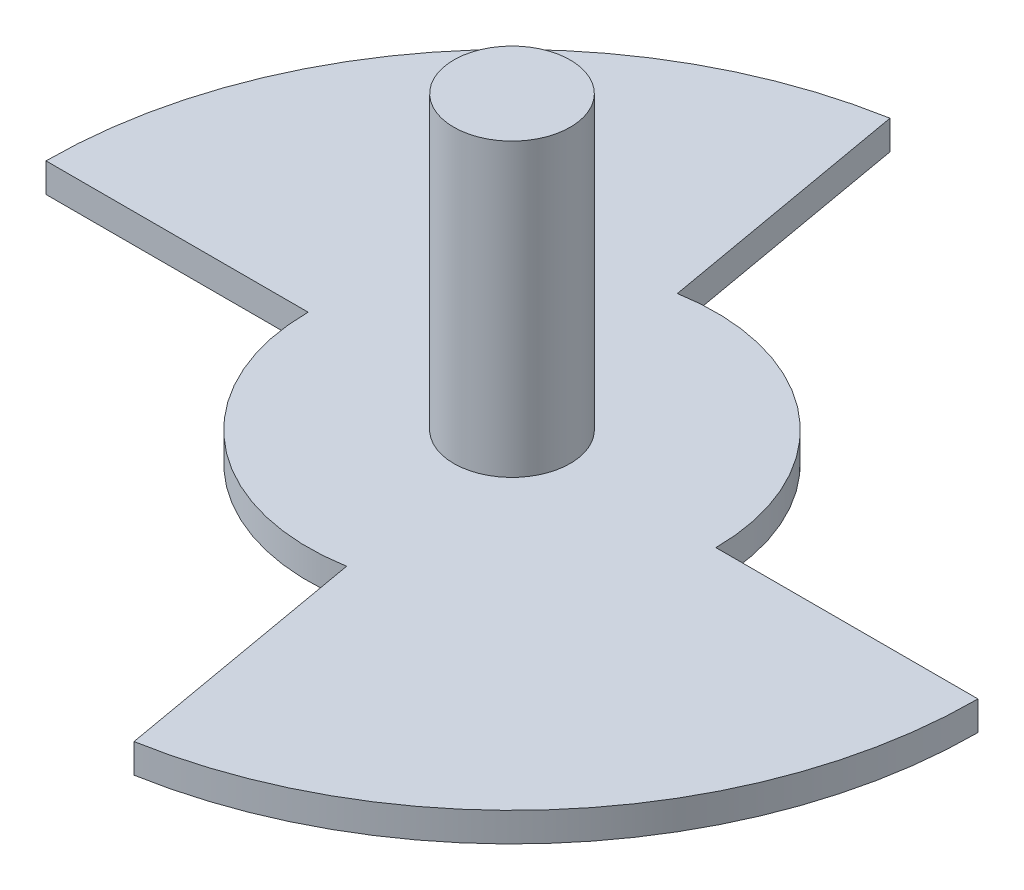
ISO-10303-21;
HEADER;
FILE_DESCRIPTION(('STEP AP214'),'2;1');
FILE_NAME('part.step','',(''),(''),'','','');
FILE_SCHEMA(('AUTOMOTIVE_DESIGN { 1 0 10303 214 1 1 1 1 }'));
ENDSEC;
DATA;
#1=APPLICATION_CONTEXT('core data for automotive mechanical design processes');
#2=APPLICATION_PROTOCOL_DEFINITION('international standard','automotive_design',2000,#1);
#3=PRODUCT_CONTEXT('',#1,'mechanical');
#4=PRODUCT('Part','Part','',(#3));
#5=PRODUCT_RELATED_PRODUCT_CATEGORY('part','',(#4));
#6=PRODUCT_DEFINITION_FORMATION('','',#4);
#7=PRODUCT_DEFINITION_CONTEXT('part definition',#1,'design');
#8=PRODUCT_DEFINITION('design','',#6,#7);
#9=PRODUCT_DEFINITION_SHAPE('','',#8);
#10=(LENGTH_UNIT() NAMED_UNIT(*) SI_UNIT(.MILLI.,.METRE.));
#11=(NAMED_UNIT(*) PLANE_ANGLE_UNIT() SI_UNIT($,.RADIAN.));
#12=(NAMED_UNIT(*) SI_UNIT($,.STERADIAN.) SOLID_ANGLE_UNIT());
#13=UNCERTAINTY_MEASURE_WITH_UNIT(LENGTH_MEASURE(1.E-05),#10,'distance_accuracy_value','');
#14=(GEOMETRIC_REPRESENTATION_CONTEXT(3) GLOBAL_UNCERTAINTY_ASSIGNED_CONTEXT((#13)) GLOBAL_UNIT_ASSIGNED_CONTEXT((#10,
#11,#12)) REPRESENTATION_CONTEXT('',''));
#15=CARTESIAN_POINT('',(0.,0.,0.));
#16=DIRECTION('',(0.,0.,1.));
#17=DIRECTION('',(1.,0.,0.));
#18=AXIS2_PLACEMENT_3D('',#15,#16,#17);
#19=CARTESIAN_POINT('',(0.,-0.25,0.));
#20=DIRECTION('',(0.,1.,0.));
#21=DIRECTION('',(0.,0.,1.));
#22=AXIS2_PLACEMENT_3D('',#19,#20,#21);
#23=CYLINDRICAL_SURFACE('',#22,3.5);
#24=DIRECTION('',(0.,1.,0.));
#25=VECTOR('',#24,1.);
#26=CARTESIAN_POINT('',(0.607768621834248,-0.25,3.44682713554273));
#27=LINE('',#26,#25);
#28=CARTESIAN_POINT('',(0.607768621834248,-0.25,3.44682713554273));
#29=VERTEX_POINT('',#28);
#30=CARTESIAN_POINT('',(0.607768621834248,0.25,3.44682713554273));
#31=VERTEX_POINT('',#30);
#32=EDGE_CURVE('E36',#29,#31,#27,.T.);
#33=ORIENTED_EDGE('',*,*,#32,.T.);
#34=CARTESIAN_POINT('',(0.,0.25,0.));
#35=DIRECTION('',(0.,1.,0.));
#36=DIRECTION('',(0.,0.,1.));
#37=AXIS2_PLACEMENT_3D('',#34,#35,#36);
#38=CIRCLE('',#37,3.5);
#39=CARTESIAN_POINT('',(-3.5,0.25,0.));
#40=VERTEX_POINT('',#39);
#41=EDGE_CURVE('E97',#40,#31,#38,.T.);
#42=ORIENTED_EDGE('',*,*,#41,.F.);
#43=DIRECTION('',(0.,1.,0.));
#44=VECTOR('',#43,1.);
#45=CARTESIAN_POINT('',(-3.5,-0.25,0.));
#46=LINE('',#45,#44);
#47=CARTESIAN_POINT('',(-3.5,-0.25,0.));
#48=VERTEX_POINT('',#47);
#49=EDGE_CURVE('E11',#48,#40,#46,.T.);
#50=ORIENTED_EDGE('',*,*,#49,.F.);
#51=CARTESIAN_POINT('',(0.,-0.25,0.));
#52=DIRECTION('',(0.,1.,0.));
#53=DIRECTION('',(0.,0.,1.));
#54=AXIS2_PLACEMENT_3D('',#51,#52,#53);
#55=CIRCLE('',#54,3.5);
#56=EDGE_CURVE('E98',#48,#29,#55,.T.);
#57=ORIENTED_EDGE('',*,*,#56,.T.);
#58=EDGE_LOOP('',(#33,#42,#50,#57));
#59=FACE_BOUND('',#58,.T.);
#60=ADVANCED_FACE('F33',(#59),#23,.T.);
#61=CARTESIAN_POINT('',(-3.5,-0.25,0.));
#62=DIRECTION('',(0.,0.,1.));
#63=DIRECTION('',(1.,0.,0.));
#64=AXIS2_PLACEMENT_3D('',#61,#62,#63);
#65=PLANE('',#64);
#66=ORIENTED_EDGE('',*,*,#49,.T.);
#67=DIRECTION('',(1.,0.,0.));
#68=VECTOR('',#67,1.);
#69=CARTESIAN_POINT('',(-3.5,0.25,0.));
#70=LINE('',#69,#68);
#71=CARTESIAN_POINT('',(-8.,0.25,0.));
#72=VERTEX_POINT('',#71);
#73=EDGE_CURVE('E115',#72,#40,#70,.T.);
#74=ORIENTED_EDGE('',*,*,#73,.F.);
#75=DIRECTION('',(0.,1.,0.));
#76=VECTOR('',#75,1.);
#77=CARTESIAN_POINT('',(-8.,-0.25,0.));
#78=LINE('',#77,#76);
#79=CARTESIAN_POINT('',(-8.,-0.25,0.));
#80=VERTEX_POINT('',#79);
#81=EDGE_CURVE('E41',#80,#72,#78,.T.);
#82=ORIENTED_EDGE('',*,*,#81,.F.);
#83=DIRECTION('',(1.,0.,0.));
#84=VECTOR('',#83,1.);
#85=CARTESIAN_POINT('',(-3.5,-0.25,0.));
#86=LINE('',#85,#84);
#87=EDGE_CURVE('E103',#80,#48,#86,.T.);
#88=ORIENTED_EDGE('',*,*,#87,.T.);
#89=EDGE_LOOP('',(#66,#74,#82,#88));
#90=FACE_BOUND('',#89,.T.);
#91=ADVANCED_FACE('F184',(#90),#65,.T.);
#92=CARTESIAN_POINT('',(0.,-0.25,0.));
#93=DIRECTION('',(0.,1.,0.));
#94=DIRECTION('',(0.,0.,1.));
#95=AXIS2_PLACEMENT_3D('',#92,#93,#94);
#96=CYLINDRICAL_SURFACE('',#95,8.);
#97=ORIENTED_EDGE('',*,*,#81,.T.);
#98=CARTESIAN_POINT('',(0.,0.25,0.));
#99=DIRECTION('',(0.,1.,0.));
#100=DIRECTION('',(0.,0.,1.));
#101=AXIS2_PLACEMENT_3D('',#98,#99,#100);
#102=CIRCLE('',#101,8.);
#103=CARTESIAN_POINT('',(-1.38918542133542,0.25,-7.87846202409767));
#104=VERTEX_POINT('',#103);
#105=EDGE_CURVE('E133',#104,#72,#102,.T.);
#106=ORIENTED_EDGE('',*,*,#105,.F.);
#107=DIRECTION('',(0.,1.,0.));
#108=VECTOR('',#107,1.);
#109=CARTESIAN_POINT('',(-1.38918542133542,-0.25,-7.87846202409767));
#110=LINE('',#109,#108);
#111=CARTESIAN_POINT('',(-1.38918542133542,-0.25,-7.87846202409767));
#112=VERTEX_POINT('',#111);
#113=EDGE_CURVE('E155',#112,#104,#110,.T.);
#114=ORIENTED_EDGE('',*,*,#113,.F.);
#115=CARTESIAN_POINT('',(0.,-0.25,0.));
#116=DIRECTION('',(0.,1.,0.));
#117=DIRECTION('',(0.,0.,1.));
#118=AXIS2_PLACEMENT_3D('',#115,#116,#117);
#119=CIRCLE('',#118,8.);
#120=EDGE_CURVE('E151',#112,#80,#119,.T.);
#121=ORIENTED_EDGE('',*,*,#120,.T.);
#122=EDGE_LOOP('',(#97,#106,#114,#121));
#123=FACE_BOUND('',#122,.T.);
#124=ADVANCED_FACE('F183',(#123),#96,.T.);
#125=CARTESIAN_POINT('',(-0.607768621834246,-0.25,-3.44682713554273));
#126=DIRECTION('',(0.984807753012209,0.,-0.173648177666927));
#127=DIRECTION('',(-0.173648177666927,0.,-0.984807753012209));
#128=AXIS2_PLACEMENT_3D('',#125,#126,#127);
#129=PLANE('',#128);
#130=ORIENTED_EDGE('',*,*,#113,.T.);
#131=DIRECTION('',(-0.173648177666927,0.,-0.984807753012209));
#132=VECTOR('',#131,1.);
#133=CARTESIAN_POINT('',(-0.607768621834246,0.25,-3.44682713554273));
#134=LINE('',#133,#132);
#135=CARTESIAN_POINT('',(-0.607768621834244,0.25,-3.44682713554273));
#136=VERTEX_POINT('',#135);
#137=EDGE_CURVE('E130',#136,#104,#134,.T.);
#138=ORIENTED_EDGE('',*,*,#137,.F.);
#139=DIRECTION('',(0.,1.,0.));
#140=VECTOR('',#139,1.);
#141=CARTESIAN_POINT('',(-0.607768621834244,-0.25,-3.44682713554273));
#142=LINE('',#141,#140);
#143=CARTESIAN_POINT('',(-0.607768621834244,-0.25,-3.44682713554273));
#144=VERTEX_POINT('',#143);
#145=EDGE_CURVE('E157',#144,#136,#142,.T.);
#146=ORIENTED_EDGE('',*,*,#145,.F.);
#147=DIRECTION('',(-0.173648177666927,0.,-0.984807753012209));
#148=VECTOR('',#147,1.);
#149=CARTESIAN_POINT('',(-0.607768621834246,-0.25,-3.44682713554273));
#150=LINE('',#149,#148);
#151=EDGE_CURVE('E148',#144,#112,#150,.T.);
#152=ORIENTED_EDGE('',*,*,#151,.T.);
#153=EDGE_LOOP('',(#130,#138,#146,#152));
#154=FACE_BOUND('',#153,.T.);
#155=ADVANCED_FACE('F179',(#154),#129,.T.);
#156=CARTESIAN_POINT('',(0.,-0.25,0.));
#157=DIRECTION('',(0.,1.,0.));
#158=DIRECTION('',(0.,0.,1.));
#159=AXIS2_PLACEMENT_3D('',#156,#157,#158);
#160=CYLINDRICAL_SURFACE('',#159,3.5);
#161=ORIENTED_EDGE('',*,*,#145,.T.);
#162=CARTESIAN_POINT('',(0.,0.25,0.));
#163=DIRECTION('',(0.,1.,0.));
#164=DIRECTION('',(0.,0.,1.));
#165=AXIS2_PLACEMENT_3D('',#162,#163,#164);
#166=CIRCLE('',#165,3.5);
#167=CARTESIAN_POINT('',(3.5,0.25,0.));
#168=VERTEX_POINT('',#167);
#169=EDGE_CURVE('E127',#168,#136,#166,.T.);
#170=ORIENTED_EDGE('',*,*,#169,.F.);
#171=DIRECTION('',(0.,1.,0.));
#172=VECTOR('',#171,1.);
#173=CARTESIAN_POINT('',(3.5,-0.25,0.));
#174=LINE('',#173,#172);
#175=CARTESIAN_POINT('',(3.5,-0.25,0.));
#176=VERTEX_POINT('',#175);
#177=EDGE_CURVE('E159',#176,#168,#174,.T.);
#178=ORIENTED_EDGE('',*,*,#177,.F.);
#179=CARTESIAN_POINT('',(0.,-0.25,0.));
#180=DIRECTION('',(0.,1.,0.));
#181=DIRECTION('',(0.,0.,1.));
#182=AXIS2_PLACEMENT_3D('',#179,#180,#181);
#183=CIRCLE('',#182,3.5);
#184=EDGE_CURVE('E145',#176,#144,#183,.T.);
#185=ORIENTED_EDGE('',*,*,#184,.T.);
#186=EDGE_LOOP('',(#161,#170,#178,#185));
#187=FACE_BOUND('',#186,.T.);
#188=ADVANCED_FACE('F172',(#187),#160,.T.);
#189=CARTESIAN_POINT('',(8.,-0.25,0.));
#190=DIRECTION('',(0.,0.,-1.));
#191=DIRECTION('',(-1.,0.,0.));
#192=AXIS2_PLACEMENT_3D('',#189,#190,#191);
#193=PLANE('',#192);
#194=ORIENTED_EDGE('',*,*,#177,.T.);
#195=DIRECTION('',(-1.,0.,0.));
#196=VECTOR('',#195,1.);
#197=CARTESIAN_POINT('',(8.,0.25,0.));
#198=LINE('',#197,#196);
#199=CARTESIAN_POINT('',(8.,0.25,0.));
#200=VERTEX_POINT('',#199);
#201=EDGE_CURVE('E124',#200,#168,#198,.T.);
#202=ORIENTED_EDGE('',*,*,#201,.F.);
#203=DIRECTION('',(0.,1.,0.));
#204=VECTOR('',#203,1.);
#205=CARTESIAN_POINT('',(8.,-0.25,0.));
#206=LINE('',#205,#204);
#207=CARTESIAN_POINT('',(8.,-0.25,0.));
#208=VERTEX_POINT('',#207);
#209=EDGE_CURVE('E161',#208,#200,#206,.T.);
#210=ORIENTED_EDGE('',*,*,#209,.F.);
#211=DIRECTION('',(-1.,0.,0.));
#212=VECTOR('',#211,1.);
#213=CARTESIAN_POINT('',(8.,-0.25,0.));
#214=LINE('',#213,#212);
#215=EDGE_CURVE('E142',#208,#176,#214,.T.);
#216=ORIENTED_EDGE('',*,*,#215,.T.);
#217=EDGE_LOOP('',(#194,#202,#210,#216));
#218=FACE_BOUND('',#217,.T.);
#219=ADVANCED_FACE('F169',(#218),#193,.T.);
#220=CARTESIAN_POINT('',(0.,-0.25,0.));
#221=DIRECTION('',(0.,1.,0.));
#222=DIRECTION('',(0.,0.,1.));
#223=AXIS2_PLACEMENT_3D('',#220,#221,#222);
#224=CYLINDRICAL_SURFACE('',#223,8.);
#225=ORIENTED_EDGE('',*,*,#209,.T.);
#226=CARTESIAN_POINT('',(0.,0.25,0.));
#227=DIRECTION('',(0.,1.,0.));
#228=DIRECTION('',(0.,0.,1.));
#229=AXIS2_PLACEMENT_3D('',#226,#227,#228);
#230=CIRCLE('',#229,8.);
#231=CARTESIAN_POINT('',(1.38918542133542,0.25,7.87846202409767));
#232=VERTEX_POINT('',#231);
#233=EDGE_CURVE('E110',#232,#200,#230,.T.);
#234=ORIENTED_EDGE('',*,*,#233,.F.);
#235=DIRECTION('',(0.,1.,0.));
#236=VECTOR('',#235,1.);
#237=CARTESIAN_POINT('',(1.38918542133542,-0.25,7.87846202409767));
#238=LINE('',#237,#236);
#239=CARTESIAN_POINT('',(1.38918542133542,-0.25,7.87846202409767));
#240=VERTEX_POINT('',#239);
#241=EDGE_CURVE('E102',#240,#232,#238,.T.);
#242=ORIENTED_EDGE('',*,*,#241,.F.);
#243=CARTESIAN_POINT('',(0.,-0.25,0.));
#244=DIRECTION('',(0.,1.,0.));
#245=DIRECTION('',(0.,0.,1.));
#246=AXIS2_PLACEMENT_3D('',#243,#244,#245);
#247=CIRCLE('',#246,8.);
#248=EDGE_CURVE('E139',#240,#208,#247,.T.);
#249=ORIENTED_EDGE('',*,*,#248,.T.);
#250=EDGE_LOOP('',(#225,#234,#242,#249));
#251=FACE_BOUND('',#250,.T.);
#252=ADVANCED_FACE('F163',(#251),#224,.T.);
#253=CARTESIAN_POINT('',(1.38918542133542,-0.25,7.87846202409767));
#254=DIRECTION('',(-0.984807753012209,0.,0.173648177666928));
#255=DIRECTION('',(0.173648177666928,0.,0.984807753012209));
#256=AXIS2_PLACEMENT_3D('',#253,#254,#255);
#257=PLANE('',#256);
#258=ORIENTED_EDGE('',*,*,#241,.T.);
#259=DIRECTION('',(0.173648177666928,0.,0.984807753012209));
#260=VECTOR('',#259,1.);
#261=CARTESIAN_POINT('',(1.38918542133542,0.25,7.87846202409767));
#262=LINE('',#261,#260);
#263=EDGE_CURVE('E105',#31,#232,#262,.T.);
#264=ORIENTED_EDGE('',*,*,#263,.F.);
#265=ORIENTED_EDGE('',*,*,#32,.F.);
#266=DIRECTION('',(0.173648177666928,0.,0.984807753012209));
#267=VECTOR('',#266,1.);
#268=CARTESIAN_POINT('',(1.38918542133542,-0.25,7.87846202409767));
#269=LINE('',#268,#267);
#270=EDGE_CURVE('E137',#29,#240,#269,.T.);
#271=ORIENTED_EDGE('',*,*,#270,.T.);
#272=EDGE_LOOP('',(#258,#264,#265,#271));
#273=FACE_BOUND('',#272,.T.);
#274=ADVANCED_FACE('F106',(#273),#257,.T.);
#275=CARTESIAN_POINT('',(0.,-0.25,0.));
#276=DIRECTION('',(0.,1.,0.));
#277=DIRECTION('',(0.,0.,1.));
#278=AXIS2_PLACEMENT_3D('',#275,#276,#277);
#279=PLANE('',#278);
#280=ORIENTED_EDGE('',*,*,#56,.F.);
#281=ORIENTED_EDGE('',*,*,#87,.F.);
#282=ORIENTED_EDGE('',*,*,#120,.F.);
#283=ORIENTED_EDGE('',*,*,#151,.F.);
#284=ORIENTED_EDGE('',*,*,#184,.F.);
#285=ORIENTED_EDGE('',*,*,#215,.F.);
#286=ORIENTED_EDGE('',*,*,#248,.F.);
#287=ORIENTED_EDGE('',*,*,#270,.F.);
#288=EDGE_LOOP('',(#280,#281,#282,#283,#284,#285,#286,#287));
#289=FACE_BOUND('',#288,.T.);
#290=ADVANCED_FACE('F175',(#289),#279,.F.);
#291=CARTESIAN_POINT('',(0.,0.25,0.));
#292=DIRECTION('',(0.,1.,0.));
#293=DIRECTION('',(0.,0.,1.));
#294=AXIS2_PLACEMENT_3D('',#291,#292,#293);
#295=PLANE('',#294);
#296=CARTESIAN_POINT('',(0.,0.25,0.));
#297=DIRECTION('',(0.,1.,0.));
#298=DIRECTION('',(0.,0.,1.));
#299=AXIS2_PLACEMENT_3D('',#296,#297,#298);
#300=CIRCLE('',#299,1.);
#301=CARTESIAN_POINT('',(0.,0.25,1.));
#302=VERTEX_POINT('',#301);
#303=EDGE_CURVE('E119',#302,#302,#300,.T.);
#304=ORIENTED_EDGE('',*,*,#303,.F.);
#305=EDGE_LOOP('',(#304));
#306=FACE_BOUND('',#305,.T.);
#307=ORIENTED_EDGE('',*,*,#41,.T.);
#308=ORIENTED_EDGE('',*,*,#263,.T.);
#309=ORIENTED_EDGE('',*,*,#233,.T.);
#310=ORIENTED_EDGE('',*,*,#201,.T.);
#311=ORIENTED_EDGE('',*,*,#169,.T.);
#312=ORIENTED_EDGE('',*,*,#137,.T.);
#313=ORIENTED_EDGE('',*,*,#105,.T.);
#314=ORIENTED_EDGE('',*,*,#73,.T.);
#315=EDGE_LOOP('',(#307,#308,#309,#310,#311,#312,#313,#314));
#316=FACE_BOUND('',#315,.T.);
#317=ADVANCED_FACE('F113',(#306,#316),#295,.T.);
#318=CARTESIAN_POINT('',(0.,5.25,0.));
#319=DIRECTION('',(0.,-1.,0.));
#320=DIRECTION('',(0.,0.,-1.));
#321=AXIS2_PLACEMENT_3D('',#318,#319,#320);
#322=CYLINDRICAL_SURFACE('',#321,1.);
#323=CARTESIAN_POINT('',(0.,5.25,0.));
#324=DIRECTION('',(0.,1.,0.));
#325=DIRECTION('',(0.,0.,1.));
#326=AXIS2_PLACEMENT_3D('',#323,#324,#325);
#327=CIRCLE('',#326,1.);
#328=CARTESIAN_POINT('',(0.,5.25,1.));
#329=VERTEX_POINT('',#328);
#330=EDGE_CURVE('E116',#329,#329,#327,.T.);
#331=ORIENTED_EDGE('',*,*,#330,.F.);
#332=EDGE_LOOP('',(#331));
#333=FACE_BOUND('',#332,.T.);
#334=ORIENTED_EDGE('',*,*,#303,.T.);
#335=EDGE_LOOP('',(#334));
#336=FACE_BOUND('',#335,.T.);
#337=ADVANCED_FACE('F209',(#333,#336),#322,.T.);
#338=CARTESIAN_POINT('',(0.,5.25,0.));
#339=DIRECTION('',(0.,1.,0.));
#340=DIRECTION('',(0.,0.,1.));
#341=AXIS2_PLACEMENT_3D('',#338,#339,#340);
#342=PLANE('',#341);
#343=ORIENTED_EDGE('',*,*,#330,.T.);
#344=EDGE_LOOP('',(#343));
#345=FACE_BOUND('',#344,.T.);
#346=ADVANCED_FACE('F214',(#345),#342,.T.);
#347=CLOSED_SHELL('',(#60,#91,#124,#155,#188,#219,#252,#274,#290,#317,#337,#346));
#348=MANIFOLD_SOLID_BREP('B2',#347);
#349=ADVANCED_BREP_SHAPE_REPRESENTATION('',(#18,#348),#14);
#350=SHAPE_DEFINITION_REPRESENTATION(#9,#349);
ENDSEC;
END-ISO-10303-21;
